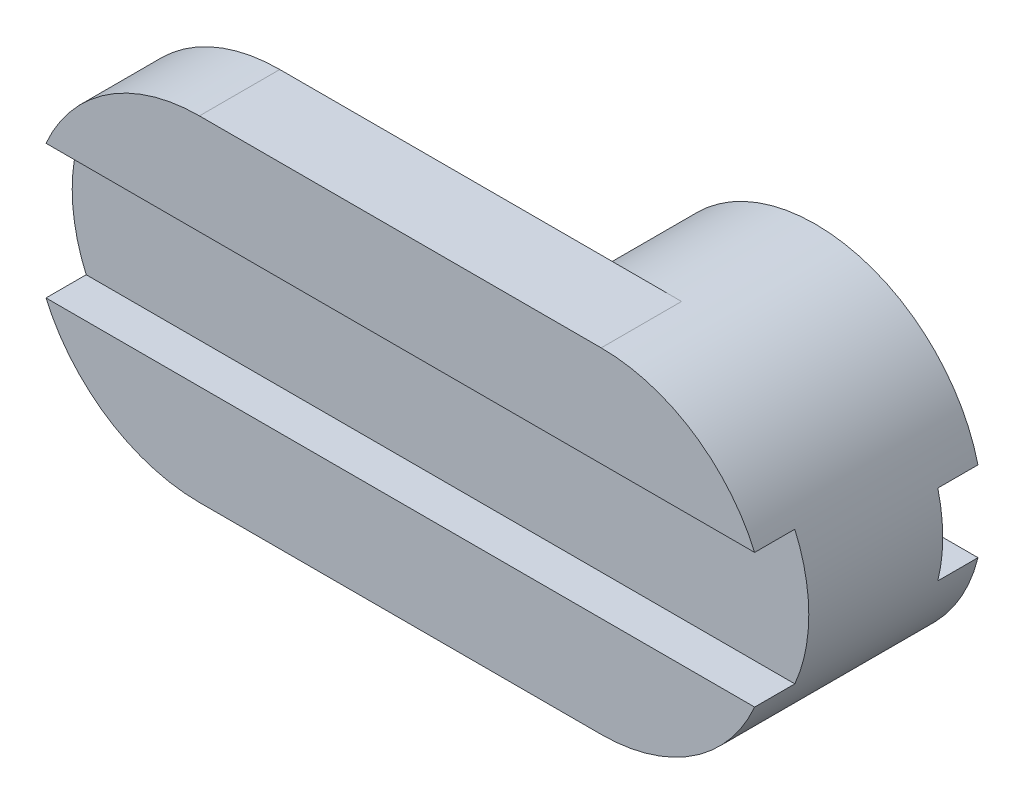
ISO-10303-21;
HEADER;
FILE_DESCRIPTION(('STEP AP214'),'2;1');
FILE_NAME('part.step','',(''),(''),'','','');
FILE_SCHEMA(('AUTOMOTIVE_DESIGN { 1 0 10303 214 1 1 1 1 }'));
ENDSEC;
DATA;
#1=APPLICATION_CONTEXT('core data for automotive mechanical design processes');
#2=APPLICATION_PROTOCOL_DEFINITION('international standard','automotive_design',2000,#1);
#3=PRODUCT_CONTEXT('',#1,'mechanical');
#4=PRODUCT('Part','Part','',(#3));
#5=PRODUCT_RELATED_PRODUCT_CATEGORY('part','',(#4));
#6=PRODUCT_DEFINITION_FORMATION('','',#4);
#7=PRODUCT_DEFINITION_CONTEXT('part definition',#1,'design');
#8=PRODUCT_DEFINITION('design','',#6,#7);
#9=PRODUCT_DEFINITION_SHAPE('','',#8);
#10=(LENGTH_UNIT() NAMED_UNIT(*) SI_UNIT(.MILLI.,.METRE.));
#11=(NAMED_UNIT(*) PLANE_ANGLE_UNIT() SI_UNIT($,.RADIAN.));
#12=(NAMED_UNIT(*) SI_UNIT($,.STERADIAN.) SOLID_ANGLE_UNIT());
#13=UNCERTAINTY_MEASURE_WITH_UNIT(LENGTH_MEASURE(1.E-05),#10,'distance_accuracy_value','');
#14=(GEOMETRIC_REPRESENTATION_CONTEXT(3) GLOBAL_UNCERTAINTY_ASSIGNED_CONTEXT((#13)) GLOBAL_UNIT_ASSIGNED_CONTEXT((#10,
#11,#12)) REPRESENTATION_CONTEXT('',''));
#15=CARTESIAN_POINT('',(0.,0.,0.));
#16=DIRECTION('',(0.,0.,1.));
#17=DIRECTION('',(1.,0.,0.));
#18=AXIS2_PLACEMENT_3D('',#15,#16,#17);
#19=CARTESIAN_POINT('',(-30.,0.,0.));
#20=DIRECTION('',(0.,0.,1.));
#21=DIRECTION('',(1.,0.,0.));
#22=AXIS2_PLACEMENT_3D('',#19,#20,#21);
#23=PLANE('',#22);
#24=CARTESIAN_POINT('',(30.,0.,0.));
#25=DIRECTION('',(0.,0.,-1.));
#26=DIRECTION('',(-1.,0.,0.));
#27=AXIS2_PLACEMENT_3D('',#24,#25,#26);
#28=CIRCLE('',#27,25.);
#29=CARTESIAN_POINT('',(30.,-25.,0.));
#30=VERTEX_POINT('',#29);
#31=CARTESIAN_POINT('',(30.,25.,0.));
#32=VERTEX_POINT('',#31);
#33=EDGE_CURVE('E301',#30,#32,#28,.T.);
#34=ORIENTED_EDGE('',*,*,#33,.F.);
#35=DIRECTION('',(1.,0.,0.));
#36=VECTOR('',#35,1.);
#37=CARTESIAN_POINT('',(30.,-25.,0.));
#38=LINE('',#37,#36);
#39=CARTESIAN_POINT('',(-30.,-25.,0.));
#40=VERTEX_POINT('',#39);
#41=EDGE_CURVE('E342',#40,#30,#38,.T.);
#42=ORIENTED_EDGE('',*,*,#41,.F.);
#43=CARTESIAN_POINT('',(-30.,0.,0.));
#44=DIRECTION('',(0.,0.,1.));
#45=DIRECTION('',(1.,0.,0.));
#46=AXIS2_PLACEMENT_3D('',#43,#44,#45);
#47=CIRCLE('',#46,25.);
#48=CARTESIAN_POINT('',(-30.,25.,0.));
#49=VERTEX_POINT('',#48);
#50=EDGE_CURVE('E326',#49,#40,#47,.T.);
#51=ORIENTED_EDGE('',*,*,#50,.F.);
#52=DIRECTION('',(-1.,0.,0.));
#53=VECTOR('',#52,1.);
#54=CARTESIAN_POINT('',(30.,25.,0.));
#55=LINE('',#54,#53);
#56=EDGE_CURVE('E345',#32,#49,#55,.T.);
#57=ORIENTED_EDGE('',*,*,#56,.F.);
#58=EDGE_LOOP('',(#34,#42,#51,#57));
#59=FACE_BOUND('',#58,.T.);
#60=CARTESIAN_POINT('',(-18.,0.,0.));
#61=DIRECTION('',(0.,0.,-1.));
#62=DIRECTION('',(-1.,0.,0.));
#63=AXIS2_PLACEMENT_3D('',#60,#61,#62);
#64=CIRCLE('',#63,12.);
#65=CARTESIAN_POINT('',(-18.,12.,0.));
#66=VERTEX_POINT('',#65);
#67=CARTESIAN_POINT('',(-18.,-12.,0.));
#68=VERTEX_POINT('',#67);
#69=EDGE_CURVE('E210',#66,#68,#64,.T.);
#70=ORIENTED_EDGE('',*,*,#69,.F.);
#71=DIRECTION('',(1.,0.,0.));
#72=VECTOR('',#71,1.);
#73=CARTESIAN_POINT('',(-18.,12.,0.));
#74=LINE('',#73,#72);
#75=CARTESIAN_POINT('',(-30.,12.,0.));
#76=VERTEX_POINT('',#75);
#77=EDGE_CURVE('E238',#76,#66,#74,.T.);
#78=ORIENTED_EDGE('',*,*,#77,.F.);
#79=CARTESIAN_POINT('',(-30.,0.,0.));
#80=DIRECTION('',(0.,0.,-1.));
#81=DIRECTION('',(-1.,0.,0.));
#82=AXIS2_PLACEMENT_3D('',#79,#80,#81);
#83=CIRCLE('',#82,12.);
#84=CARTESIAN_POINT('',(-30.,-12.,0.));
#85=VERTEX_POINT('',#84);
#86=EDGE_CURVE('E53',#85,#76,#83,.T.);
#87=ORIENTED_EDGE('',*,*,#86,.F.);
#88=DIRECTION('',(-1.,0.,0.));
#89=VECTOR('',#88,1.);
#90=CARTESIAN_POINT('',(-18.,-12.,0.));
#91=LINE('',#90,#89);
#92=EDGE_CURVE('E48',#68,#85,#91,.T.);
#93=ORIENTED_EDGE('',*,*,#92,.F.);
#94=EDGE_LOOP('',(#70,#78,#87,#93));
#95=FACE_BOUND('',#94,.T.);
#96=ADVANCED_FACE('F33',(#59,#95),#23,.F.);
#97=CARTESIAN_POINT('',(30.,0.,-20.));
#98=DIRECTION('',(0.,0.,-1.));
#99=DIRECTION('',(-1.,0.,0.));
#100=AXIS2_PLACEMENT_3D('',#97,#98,#99);
#101=PLANE('',#100);
#102=DIRECTION('',(1.,0.,0.));
#103=VECTOR('',#102,1.);
#104=CARTESIAN_POINT('',(55.,5.99999999999999,-20.));
#105=LINE('',#104,#103);
#106=CARTESIAN_POINT('',(5.7306778009768,5.99999999999999,-20.));
#107=VERTEX_POINT('',#106);
#108=CARTESIAN_POINT('',(22.,5.99999999999999,-20.));
#109=VERTEX_POINT('',#108);
#110=EDGE_CURVE('E272',#107,#109,#105,.T.);
#111=ORIENTED_EDGE('',*,*,#110,.F.);
#112=CARTESIAN_POINT('',(30.,0.,-20.));
#113=DIRECTION('',(0.,0.,-1.));
#114=DIRECTION('',(-1.,0.,0.));
#115=AXIS2_PLACEMENT_3D('',#112,#113,#114);
#116=CIRCLE('',#115,25.);
#117=CARTESIAN_POINT('',(54.2693221990232,5.99999999999999,-20.));
#118=VERTEX_POINT('',#117);
#119=EDGE_CURVE('E300',#107,#118,#116,.T.);
#120=ORIENTED_EDGE('',*,*,#119,.T.);
#121=CARTESIAN_POINT('',(38.,5.99999999999999,-20.));
#122=VERTEX_POINT('',#121);
#123=EDGE_CURVE('E261',#122,#118,#105,.T.);
#124=ORIENTED_EDGE('',*,*,#123,.F.);
#125=CARTESIAN_POINT('',(30.,0.,-20.));
#126=DIRECTION('',(0.,0.,-1.));
#127=DIRECTION('',(-1.,0.,0.));
#128=AXIS2_PLACEMENT_3D('',#125,#126,#127);
#129=CIRCLE('',#128,10.);
#130=EDGE_CURVE('E291',#109,#122,#129,.T.);
#131=ORIENTED_EDGE('',*,*,#130,.F.);
#132=EDGE_LOOP('',(#111,#120,#124,#131));
#133=FACE_BOUND('',#132,.T.);
#134=ADVANCED_FACE('F395',(#133),#101,.T.);
#135=CARTESIAN_POINT('',(-30.,0.,12.));
#136=DIRECTION('',(0.,0.,1.));
#137=DIRECTION('',(1.,0.,0.));
#138=AXIS2_PLACEMENT_3D('',#135,#136,#137);
#139=PLANE('',#138);
#140=DIRECTION('',(-1.,0.,0.));
#141=VECTOR('',#140,1.);
#142=CARTESIAN_POINT('',(-30.,10.,12.));
#143=LINE('',#142,#141);
#144=CARTESIAN_POINT('',(52.9128784747792,10.,12.));
#145=VERTEX_POINT('',#144);
#146=CARTESIAN_POINT('',(-52.9128784747792,9.99999999999999,12.));
#147=VERTEX_POINT('',#146);
#148=EDGE_CURVE('E360',#145,#147,#143,.T.);
#149=ORIENTED_EDGE('',*,*,#148,.F.);
#150=CARTESIAN_POINT('',(30.,0.,12.));
#151=DIRECTION('',(0.,0.,1.));
#152=DIRECTION('',(1.,0.,0.));
#153=AXIS2_PLACEMENT_3D('',#150,#151,#152);
#154=CIRCLE('',#153,25.);
#155=CARTESIAN_POINT('',(30.,25.,12.));
#156=VERTEX_POINT('',#155);
#157=EDGE_CURVE('E333',#145,#156,#154,.T.);
#158=ORIENTED_EDGE('',*,*,#157,.T.);
#159=DIRECTION('',(-1.,0.,0.));
#160=VECTOR('',#159,1.);
#161=CARTESIAN_POINT('',(30.,25.,12.));
#162=LINE('',#161,#160);
#163=CARTESIAN_POINT('',(-30.,25.,12.));
#164=VERTEX_POINT('',#163);
#165=EDGE_CURVE('E337',#156,#164,#162,.T.);
#166=ORIENTED_EDGE('',*,*,#165,.T.);
#167=CARTESIAN_POINT('',(-30.,0.,12.));
#168=DIRECTION('',(0.,0.,1.));
#169=DIRECTION('',(1.,0.,0.));
#170=AXIS2_PLACEMENT_3D('',#167,#168,#169);
#171=CIRCLE('',#170,25.);
#172=EDGE_CURVE('E327',#164,#147,#171,.T.);
#173=ORIENTED_EDGE('',*,*,#172,.T.);
#174=EDGE_LOOP('',(#149,#158,#166,#173));
#175=FACE_BOUND('',#174,.T.);
#176=ADVANCED_FACE('F431',(#175),#139,.T.);
#177=CARTESIAN_POINT('',(-30.,0.,12.));
#178=DIRECTION('',(0.,0.,-1.));
#179=DIRECTION('',(-1.,0.,0.));
#180=AXIS2_PLACEMENT_3D('',#177,#178,#179);
#181=CYLINDRICAL_SURFACE('',#180,25.);
#182=CARTESIAN_POINT('',(-30.,0.,6.));
#183=DIRECTION('',(0.,0.,1.));
#184=DIRECTION('',(1.,0.,0.));
#185=AXIS2_PLACEMENT_3D('',#182,#183,#184);
#186=CIRCLE('',#185,25.);
#187=CARTESIAN_POINT('',(-52.9128784747792,9.99999999999999,6.));
#188=VERTEX_POINT('',#187);
#189=CARTESIAN_POINT('',(-52.9128784747792,-10.,6.));
#190=VERTEX_POINT('',#189);
#191=EDGE_CURVE('E324',#188,#190,#186,.T.);
#192=ORIENTED_EDGE('',*,*,#191,.F.);
#193=DIRECTION('',(0.,0.,-1.));
#194=VECTOR('',#193,1.);
#195=CARTESIAN_POINT('',(-52.9128784747792,9.99999999999999,12.));
#196=LINE('',#195,#194);
#197=EDGE_CURVE('E321',#188,#147,#196,.F.);
#198=ORIENTED_EDGE('',*,*,#197,.T.);
#199=ORIENTED_EDGE('',*,*,#172,.F.);
#200=DIRECTION('',(0.,0.,-1.));
#201=VECTOR('',#200,1.);
#202=CARTESIAN_POINT('',(-30.,25.,12.));
#203=LINE('',#202,#201);
#204=EDGE_CURVE('E339',#164,#49,#203,.T.);
#205=ORIENTED_EDGE('',*,*,#204,.T.);
#206=ORIENTED_EDGE('',*,*,#50,.T.);
#207=DIRECTION('',(0.,0.,-1.));
#208=VECTOR('',#207,1.);
#209=CARTESIAN_POINT('',(-30.,-25.,12.));
#210=LINE('',#209,#208);
#211=CARTESIAN_POINT('',(-30.,-25.,12.));
#212=VERTEX_POINT('',#211);
#213=EDGE_CURVE('E355',#212,#40,#210,.T.);
#214=ORIENTED_EDGE('',*,*,#213,.F.);
#215=CARTESIAN_POINT('',(-52.9128784747792,-10.,12.));
#216=VERTEX_POINT('',#215);
#217=EDGE_CURVE('E331',#216,#212,#171,.T.);
#218=ORIENTED_EDGE('',*,*,#217,.F.);
#219=DIRECTION('',(0.,0.,-1.));
#220=VECTOR('',#219,1.);
#221=CARTESIAN_POINT('',(-52.9128784747792,-10.,12.));
#222=LINE('',#221,#220);
#223=EDGE_CURVE('E315',#216,#190,#222,.T.);
#224=ORIENTED_EDGE('',*,*,#223,.T.);
#225=EDGE_LOOP('',(#192,#198,#199,#205,#206,#214,#218,#224));
#226=FACE_BOUND('',#225,.T.);
#227=ADVANCED_FACE('F35',(#226),#181,.T.);
#228=CARTESIAN_POINT('',(30.,-25.,12.));
#229=DIRECTION('',(0.,1.,0.));
#230=DIRECTION('',(-1.,0.,0.));
#231=AXIS2_PLACEMENT_3D('',#228,#229,#230);
#232=PLANE('',#231);
#233=ORIENTED_EDGE('',*,*,#41,.T.);
#234=DIRECTION('',(0.,0.,-1.));
#235=VECTOR('',#234,1.);
#236=CARTESIAN_POINT('',(30.,-25.,12.));
#237=LINE('',#236,#235);
#238=CARTESIAN_POINT('',(30.,-25.,12.));
#239=VERTEX_POINT('',#238);
#240=EDGE_CURVE('E352',#239,#30,#237,.T.);
#241=ORIENTED_EDGE('',*,*,#240,.F.);
#242=DIRECTION('',(1.,0.,0.));
#243=VECTOR('',#242,1.);
#244=CARTESIAN_POINT('',(30.,-25.,12.));
#245=LINE('',#244,#243);
#246=EDGE_CURVE('E330',#212,#239,#245,.T.);
#247=ORIENTED_EDGE('',*,*,#246,.F.);
#248=ORIENTED_EDGE('',*,*,#213,.T.);
#249=EDGE_LOOP('',(#233,#241,#247,#248));
#250=FACE_BOUND('',#249,.T.);
#251=ADVANCED_FACE('F582',(#250),#232,.F.);
#252=CARTESIAN_POINT('',(30.,0.,12.));
#253=DIRECTION('',(0.,0.,-1.));
#254=DIRECTION('',(-1.,0.,0.));
#255=AXIS2_PLACEMENT_3D('',#252,#253,#254);
#256=CYLINDRICAL_SURFACE('',#255,25.);
#257=CARTESIAN_POINT('',(30.,0.,-14.));
#258=DIRECTION('',(0.,0.,-1.));
#259=DIRECTION('',(-1.,0.,0.));
#260=AXIS2_PLACEMENT_3D('',#257,#258,#259);
#261=CIRCLE('',#260,25.);
#262=CARTESIAN_POINT('',(54.2693221990232,5.99999999999999,-14.));
#263=VERTEX_POINT('',#262);
#264=CARTESIAN_POINT('',(54.2693221990232,-5.99999999999999,-14.));
#265=VERTEX_POINT('',#264);
#266=EDGE_CURVE('E275',#263,#265,#261,.T.);
#267=ORIENTED_EDGE('',*,*,#266,.F.);
#268=DIRECTION('',(0.,0.,-1.));
#269=VECTOR('',#268,1.);
#270=CARTESIAN_POINT('',(54.2693221990232,5.99999999999999,12.));
#271=LINE('',#270,#269);
#272=EDGE_CURVE('E287',#263,#118,#271,.T.);
#273=ORIENTED_EDGE('',*,*,#272,.T.);
#274=ORIENTED_EDGE('',*,*,#119,.F.);
#275=DIRECTION('',(0.,0.,-1.));
#276=VECTOR('',#275,1.);
#277=CARTESIAN_POINT('',(5.7306778009768,5.99999999999999,12.));
#278=LINE('',#277,#276);
#279=CARTESIAN_POINT('',(5.7306778009768,5.99999999999999,-14.));
#280=VERTEX_POINT('',#279);
#281=EDGE_CURVE('E284',#107,#280,#278,.F.);
#282=ORIENTED_EDGE('',*,*,#281,.T.);
#283=CARTESIAN_POINT('',(5.7306778009768,-5.99999999999999,-14.));
#284=VERTEX_POINT('',#283);
#285=EDGE_CURVE('E278',#284,#280,#261,.T.);
#286=ORIENTED_EDGE('',*,*,#285,.F.);
#287=DIRECTION('',(0.,0.,-1.));
#288=VECTOR('',#287,1.);
#289=CARTESIAN_POINT('',(5.7306778009768,-5.99999999999999,12.));
#290=LINE('',#289,#288);
#291=CARTESIAN_POINT('',(5.7306778009768,-5.99999999999999,-20.));
#292=VERTEX_POINT('',#291);
#293=EDGE_CURVE('E281',#284,#292,#290,.T.);
#294=ORIENTED_EDGE('',*,*,#293,.T.);
#295=CARTESIAN_POINT('',(54.2693221990232,-5.99999999999999,-20.));
#296=VERTEX_POINT('',#295);
#297=EDGE_CURVE('E294',#296,#292,#116,.T.);
#298=ORIENTED_EDGE('',*,*,#297,.F.);
#299=DIRECTION('',(0.,0.,-1.));
#300=VECTOR('',#299,1.);
#301=CARTESIAN_POINT('',(54.2693221990232,-5.99999999999999,12.));
#302=LINE('',#301,#300);
#303=EDGE_CURVE('E277',#296,#265,#302,.F.);
#304=ORIENTED_EDGE('',*,*,#303,.T.);
#305=EDGE_LOOP('',(#267,#273,#274,#282,#286,#294,#298,#304));
#306=FACE_BOUND('',#305,.T.);
#307=ORIENTED_EDGE('',*,*,#157,.F.);
#308=DIRECTION('',(0.,0.,-1.));
#309=VECTOR('',#308,1.);
#310=CARTESIAN_POINT('',(52.9128784747792,10.,12.));
#311=LINE('',#310,#309);
#312=CARTESIAN_POINT('',(52.9128784747792,10.,6.));
#313=VERTEX_POINT('',#312);
#314=EDGE_CURVE('E318',#145,#313,#311,.T.);
#315=ORIENTED_EDGE('',*,*,#314,.T.);
#316=CARTESIAN_POINT('',(30.,0.,6.));
#317=DIRECTION('',(0.,0.,1.));
#318=DIRECTION('',(1.,0.,0.));
#319=AXIS2_PLACEMENT_3D('',#316,#317,#318);
#320=CIRCLE('',#319,25.);
#321=CARTESIAN_POINT('',(52.9128784747792,-9.99999999999999,6.));
#322=VERTEX_POINT('',#321);
#323=EDGE_CURVE('E305',#322,#313,#320,.T.);
#324=ORIENTED_EDGE('',*,*,#323,.F.);
#325=DIRECTION('',(0.,0.,-1.));
#326=VECTOR('',#325,1.);
#327=CARTESIAN_POINT('',(52.9128784747792,-9.99999999999999,12.));
#328=LINE('',#327,#326);
#329=CARTESIAN_POINT('',(52.9128784747792,-9.99999999999999,12.));
#330=VERTEX_POINT('',#329);
#331=EDGE_CURVE('E312',#322,#330,#328,.F.);
#332=ORIENTED_EDGE('',*,*,#331,.T.);
#333=EDGE_CURVE('E334',#239,#330,#154,.T.);
#334=ORIENTED_EDGE('',*,*,#333,.F.);
#335=ORIENTED_EDGE('',*,*,#240,.T.);
#336=ORIENTED_EDGE('',*,*,#33,.T.);
#337=DIRECTION('',(0.,0.,-1.));
#338=VECTOR('',#337,1.);
#339=CARTESIAN_POINT('',(30.,25.,12.));
#340=LINE('',#339,#338);
#341=EDGE_CURVE('E349',#156,#32,#340,.T.);
#342=ORIENTED_EDGE('',*,*,#341,.F.);
#343=EDGE_LOOP('',(#307,#315,#324,#332,#334,#335,#336,#342));
#344=FACE_BOUND('',#343,.T.);
#345=ADVANCED_FACE('F391',(#306,#344),#256,.T.);
#346=CARTESIAN_POINT('',(30.,25.,12.));
#347=DIRECTION('',(0.,-1.,0.));
#348=DIRECTION('',(1.,0.,0.));
#349=AXIS2_PLACEMENT_3D('',#346,#347,#348);
#350=PLANE('',#349);
#351=ORIENTED_EDGE('',*,*,#56,.T.);
#352=ORIENTED_EDGE('',*,*,#204,.F.);
#353=ORIENTED_EDGE('',*,*,#165,.F.);
#354=ORIENTED_EDGE('',*,*,#341,.T.);
#355=EDGE_LOOP('',(#351,#352,#353,#354));
#356=FACE_BOUND('',#355,.T.);
#357=ADVANCED_FACE('F581',(#356),#350,.F.);
#358=DIRECTION('',(1.,0.,0.));
#359=VECTOR('',#358,1.);
#360=CARTESIAN_POINT('',(-30.,-10.,12.));
#361=LINE('',#360,#359);
#362=EDGE_CURVE('E358',#216,#330,#361,.T.);
#363=ORIENTED_EDGE('',*,*,#362,.F.);
#364=ORIENTED_EDGE('',*,*,#217,.T.);
#365=ORIENTED_EDGE('',*,*,#246,.T.);
#366=ORIENTED_EDGE('',*,*,#333,.T.);
#367=EDGE_LOOP('',(#363,#364,#365,#366));
#368=FACE_BOUND('',#367,.T.);
#369=ADVANCED_FACE('F527',(#368),#139,.T.);
#370=CARTESIAN_POINT('',(0.,0.,6.));
#371=DIRECTION('',(0.,0.,1.));
#372=DIRECTION('',(1.,0.,0.));
#373=AXIS2_PLACEMENT_3D('',#370,#371,#372);
#374=PLANE('',#373);
#375=ORIENTED_EDGE('',*,*,#191,.T.);
#376=DIRECTION('',(1.,0.,0.));
#377=VECTOR('',#376,1.);
#378=CARTESIAN_POINT('',(57.6844646731594,-9.99999999999999,6.));
#379=LINE('',#378,#377);
#380=EDGE_CURVE('E306',#190,#322,#379,.T.);
#381=ORIENTED_EDGE('',*,*,#380,.T.);
#382=ORIENTED_EDGE('',*,*,#323,.T.);
#383=DIRECTION('',(-1.,0.,0.));
#384=VECTOR('',#383,1.);
#385=CARTESIAN_POINT('',(57.6844646731594,10.,6.));
#386=LINE('',#385,#384);
#387=EDGE_CURVE('E309',#313,#188,#386,.T.);
#388=ORIENTED_EDGE('',*,*,#387,.T.);
#389=EDGE_LOOP('',(#375,#381,#382,#388));
#390=FACE_BOUND('',#389,.T.);
#391=ADVANCED_FACE('F541',(#390),#374,.T.);
#392=CARTESIAN_POINT('',(57.6844646731594,10.,6.));
#393=DIRECTION('',(0.,1.,0.));
#394=DIRECTION('',(-1.,0.,0.));
#395=AXIS2_PLACEMENT_3D('',#392,#393,#394);
#396=PLANE('',#395);
#397=ORIENTED_EDGE('',*,*,#387,.F.);
#398=ORIENTED_EDGE('',*,*,#314,.F.);
#399=ORIENTED_EDGE('',*,*,#148,.T.);
#400=ORIENTED_EDGE('',*,*,#197,.F.);
#401=EDGE_LOOP('',(#397,#398,#399,#400));
#402=FACE_BOUND('',#401,.T.);
#403=ADVANCED_FACE('F547',(#402),#396,.F.);
#404=CARTESIAN_POINT('',(57.6844646731594,-9.99999999999999,6.));
#405=DIRECTION('',(0.,-1.,0.));
#406=DIRECTION('',(1.,0.,0.));
#407=AXIS2_PLACEMENT_3D('',#404,#405,#406);
#408=PLANE('',#407);
#409=ORIENTED_EDGE('',*,*,#362,.T.);
#410=ORIENTED_EDGE('',*,*,#331,.F.);
#411=ORIENTED_EDGE('',*,*,#380,.F.);
#412=ORIENTED_EDGE('',*,*,#223,.F.);
#413=EDGE_LOOP('',(#409,#410,#411,#412));
#414=FACE_BOUND('',#413,.T.);
#415=ADVANCED_FACE('F556',(#414),#408,.F.);
#416=DIRECTION('',(-1.,0.,0.));
#417=VECTOR('',#416,1.);
#418=CARTESIAN_POINT('',(55.,-5.99999999999999,-20.));
#419=LINE('',#418,#417);
#420=CARTESIAN_POINT('',(38.,-5.99999999999999,-20.));
#421=VERTEX_POINT('',#420);
#422=EDGE_CURVE('E266',#296,#421,#419,.T.);
#423=ORIENTED_EDGE('',*,*,#422,.F.);
#424=ORIENTED_EDGE('',*,*,#297,.T.);
#425=CARTESIAN_POINT('',(22.,-5.99999999999999,-20.));
#426=VERTEX_POINT('',#425);
#427=EDGE_CURVE('E273',#426,#292,#419,.T.);
#428=ORIENTED_EDGE('',*,*,#427,.F.);
#429=EDGE_CURVE('E295',#421,#426,#129,.T.);
#430=ORIENTED_EDGE('',*,*,#429,.F.);
#431=EDGE_LOOP('',(#423,#424,#428,#430));
#432=FACE_BOUND('',#431,.T.);
#433=ADVANCED_FACE('F412',(#432),#101,.T.);
#434=CARTESIAN_POINT('',(30.,0.,-20.));
#435=DIRECTION('',(0.,0.,1.));
#436=DIRECTION('',(1.,0.,0.));
#437=AXIS2_PLACEMENT_3D('',#434,#435,#436);
#438=CYLINDRICAL_SURFACE('',#437,10.);
#439=DIRECTION('',(0.,0.,1.));
#440=VECTOR('',#439,1.);
#441=CARTESIAN_POINT('',(38.,5.99999999999999,-20.));
#442=LINE('',#441,#440);
#443=CARTESIAN_POINT('',(38.,5.99999999999999,-14.));
#444=VERTEX_POINT('',#443);
#445=EDGE_CURVE('E11',#444,#122,#442,.F.);
#446=ORIENTED_EDGE('',*,*,#445,.F.);
#447=CARTESIAN_POINT('',(30.,0.,-14.));
#448=DIRECTION('',(0.,0.,-1.));
#449=DIRECTION('',(-1.,0.,0.));
#450=AXIS2_PLACEMENT_3D('',#447,#448,#449);
#451=CIRCLE('',#450,10.);
#452=CARTESIAN_POINT('',(38.,-5.99999999999999,-14.));
#453=VERTEX_POINT('',#452);
#454=EDGE_CURVE('E366',#444,#453,#451,.T.);
#455=ORIENTED_EDGE('',*,*,#454,.T.);
#456=DIRECTION('',(0.,0.,1.));
#457=VECTOR('',#456,1.);
#458=CARTESIAN_POINT('',(38.,-5.99999999999999,-20.));
#459=LINE('',#458,#457);
#460=EDGE_CURVE('E41',#421,#453,#459,.T.);
#461=ORIENTED_EDGE('',*,*,#460,.F.);
#462=ORIENTED_EDGE('',*,*,#429,.T.);
#463=DIRECTION('',(0.,0.,1.));
#464=VECTOR('',#463,1.);
#465=CARTESIAN_POINT('',(22.,-5.99999999999999,-20.));
#466=LINE('',#465,#464);
#467=CARTESIAN_POINT('',(22.,-5.99999999999999,-14.));
#468=VERTEX_POINT('',#467);
#469=EDGE_CURVE('E365',#468,#426,#466,.F.);
#470=ORIENTED_EDGE('',*,*,#469,.F.);
#471=CARTESIAN_POINT('',(22.,5.99999999999999,-14.));
#472=VERTEX_POINT('',#471);
#473=EDGE_CURVE('E304',#468,#472,#451,.T.);
#474=ORIENTED_EDGE('',*,*,#473,.T.);
#475=DIRECTION('',(0.,0.,1.));
#476=VECTOR('',#475,1.);
#477=CARTESIAN_POINT('',(22.,5.99999999999999,-20.));
#478=LINE('',#477,#476);
#479=EDGE_CURVE('E368',#109,#472,#478,.T.);
#480=ORIENTED_EDGE('',*,*,#479,.F.);
#481=ORIENTED_EDGE('',*,*,#130,.T.);
#482=EDGE_LOOP('',(#446,#455,#461,#462,#470,#474,#480,#481));
#483=FACE_BOUND('',#482,.T.);
#484=CARTESIAN_POINT('',(30.,0.,0.));
#485=DIRECTION('',(0.,0.,-1.));
#486=DIRECTION('',(-1.,0.,0.));
#487=AXIS2_PLACEMENT_3D('',#484,#485,#486);
#488=CIRCLE('',#487,10.);
#489=CARTESIAN_POINT('',(20.,0.,0.));
#490=VERTEX_POINT('',#489);
#491=EDGE_CURVE('E290',#490,#490,#488,.T.);
#492=ORIENTED_EDGE('',*,*,#491,.F.);
#493=EDGE_LOOP('',(#492));
#494=FACE_BOUND('',#493,.T.);
#495=ADVANCED_FACE('F377',(#483,#494),#438,.F.);
#496=ORIENTED_EDGE('',*,*,#491,.T.);
#497=EDGE_LOOP('',(#496));
#498=FACE_BOUND('',#497,.T.);
#499=ADVANCED_FACE('F426',(#498),#23,.F.);
#500=CARTESIAN_POINT('',(0.,0.,-14.));
#501=DIRECTION('',(0.,0.,-1.));
#502=DIRECTION('',(-1.,0.,0.));
#503=AXIS2_PLACEMENT_3D('',#500,#501,#502);
#504=PLANE('',#503);
#505=ORIENTED_EDGE('',*,*,#285,.T.);
#506=DIRECTION('',(1.,0.,0.));
#507=VECTOR('',#506,1.);
#508=CARTESIAN_POINT('',(55.,5.99999999999999,-14.));
#509=LINE('',#508,#507);
#510=EDGE_CURVE('E265',#280,#472,#509,.T.);
#511=ORIENTED_EDGE('',*,*,#510,.T.);
#512=ORIENTED_EDGE('',*,*,#473,.F.);
#513=DIRECTION('',(-1.,0.,0.));
#514=VECTOR('',#513,1.);
#515=CARTESIAN_POINT('',(55.,-5.99999999999999,-14.));
#516=LINE('',#515,#514);
#517=EDGE_CURVE('E267',#468,#284,#516,.T.);
#518=ORIENTED_EDGE('',*,*,#517,.T.);
#519=EDGE_LOOP('',(#505,#511,#512,#518));
#520=FACE_BOUND('',#519,.T.);
#521=ADVANCED_FACE('F404',(#520),#504,.T.);
#522=CARTESIAN_POINT('',(55.,-5.99999999999999,-14.));
#523=DIRECTION('',(0.,-1.,0.));
#524=DIRECTION('',(0.,0.,-1.));
#525=AXIS2_PLACEMENT_3D('',#522,#523,#524);
#526=PLANE('',#525);
#527=ORIENTED_EDGE('',*,*,#517,.F.);
#528=ORIENTED_EDGE('',*,*,#469,.T.);
#529=ORIENTED_EDGE('',*,*,#427,.T.);
#530=ORIENTED_EDGE('',*,*,#293,.F.);
#531=EDGE_LOOP('',(#527,#528,#529,#530));
#532=FACE_BOUND('',#531,.T.);
#533=ADVANCED_FACE('F407',(#532),#526,.F.);
#534=CARTESIAN_POINT('',(55.,5.99999999999999,-14.));
#535=DIRECTION('',(0.,1.,0.));
#536=DIRECTION('',(0.,0.,1.));
#537=AXIS2_PLACEMENT_3D('',#534,#535,#536);
#538=PLANE('',#537);
#539=ORIENTED_EDGE('',*,*,#110,.T.);
#540=ORIENTED_EDGE('',*,*,#479,.T.);
#541=ORIENTED_EDGE('',*,*,#510,.F.);
#542=ORIENTED_EDGE('',*,*,#281,.F.);
#543=EDGE_LOOP('',(#539,#540,#541,#542));
#544=FACE_BOUND('',#543,.T.);
#545=ADVANCED_FACE('F399',(#544),#538,.F.);
#546=EDGE_CURVE('E262',#444,#263,#509,.T.);
#547=ORIENTED_EDGE('',*,*,#546,.F.);
#548=ORIENTED_EDGE('',*,*,#445,.T.);
#549=ORIENTED_EDGE('',*,*,#123,.T.);
#550=ORIENTED_EDGE('',*,*,#272,.F.);
#551=EDGE_LOOP('',(#547,#548,#549,#550));
#552=FACE_BOUND('',#551,.T.);
#553=ADVANCED_FACE('F386',(#552),#538,.F.);
#554=ORIENTED_EDGE('',*,*,#422,.T.);
#555=ORIENTED_EDGE('',*,*,#460,.T.);
#556=EDGE_CURVE('E270',#265,#453,#516,.T.);
#557=ORIENTED_EDGE('',*,*,#556,.F.);
#558=ORIENTED_EDGE('',*,*,#303,.F.);
#559=EDGE_LOOP('',(#554,#555,#557,#558));
#560=FACE_BOUND('',#559,.T.);
#561=ADVANCED_FACE('F413',(#560),#526,.F.);
#562=ORIENTED_EDGE('',*,*,#266,.T.);
#563=ORIENTED_EDGE('',*,*,#556,.T.);
#564=ORIENTED_EDGE('',*,*,#454,.F.);
#565=ORIENTED_EDGE('',*,*,#546,.T.);
#566=EDGE_LOOP('',(#562,#563,#564,#565));
#567=FACE_BOUND('',#566,.T.);
#568=ADVANCED_FACE('F383',(#567),#504,.T.);
#569=CARTESIAN_POINT('',(-18.,0.,-4.));
#570=DIRECTION('',(0.,0.,-1.));
#571=DIRECTION('',(-1.,0.,0.));
#572=AXIS2_PLACEMENT_3D('',#569,#570,#571);
#573=PLANE('',#572);
#574=CARTESIAN_POINT('',(-18.,0.,-4.));
#575=DIRECTION('',(0.,0.,-1.));
#576=DIRECTION('',(-1.,0.,0.));
#577=AXIS2_PLACEMENT_3D('',#574,#575,#576);
#578=CIRCLE('',#577,12.);
#579=CARTESIAN_POINT('',(-18.,12.,-4.));
#580=VERTEX_POINT('',#579);
#581=CARTESIAN_POINT('',(-18.,-12.,-4.));
#582=VERTEX_POINT('',#581);
#583=EDGE_CURVE('E234',#580,#582,#578,.T.);
#584=ORIENTED_EDGE('',*,*,#583,.T.);
#585=DIRECTION('',(-1.,0.,0.));
#586=VECTOR('',#585,1.);
#587=CARTESIAN_POINT('',(-18.,-12.,-4.));
#588=LINE('',#587,#586);
#589=CARTESIAN_POINT('',(-30.,-12.,-4.));
#590=VERTEX_POINT('',#589);
#591=EDGE_CURVE('E237',#582,#590,#588,.T.);
#592=ORIENTED_EDGE('',*,*,#591,.T.);
#593=CARTESIAN_POINT('',(-30.,0.,-4.));
#594=DIRECTION('',(0.,0.,-1.));
#595=DIRECTION('',(-1.,0.,0.));
#596=AXIS2_PLACEMENT_3D('',#593,#594,#595);
#597=CIRCLE('',#596,12.);
#598=CARTESIAN_POINT('',(-30.,12.,-4.));
#599=VERTEX_POINT('',#598);
#600=EDGE_CURVE('E240',#590,#599,#597,.T.);
#601=ORIENTED_EDGE('',*,*,#600,.T.);
#602=DIRECTION('',(1.,0.,0.));
#603=VECTOR('',#602,1.);
#604=CARTESIAN_POINT('',(-18.,12.,-4.));
#605=LINE('',#604,#603);
#606=EDGE_CURVE('E242',#599,#580,#605,.T.);
#607=ORIENTED_EDGE('',*,*,#606,.T.);
#608=EDGE_LOOP('',(#584,#592,#601,#607));
#609=FACE_BOUND('',#608,.T.);
#610=DIRECTION('',(-1.,0.,0.));
#611=VECTOR('',#610,1.);
#612=CARTESIAN_POINT('',(-18.,-5.99999999999999,-4.));
#613=LINE('',#612,#611);
#614=CARTESIAN_POINT('',(-18.,-5.99999999999999,-4.));
#615=VERTEX_POINT('',#614);
#616=CARTESIAN_POINT('',(-30.,-6.,-4.));
#617=VERTEX_POINT('',#616);
#618=EDGE_CURVE('E202',#615,#617,#613,.T.);
#619=ORIENTED_EDGE('',*,*,#618,.F.);
#620=CARTESIAN_POINT('',(-18.,0.,-4.));
#621=DIRECTION('',(0.,0.,-1.));
#622=DIRECTION('',(-1.,0.,0.));
#623=AXIS2_PLACEMENT_3D('',#620,#621,#622);
#624=CIRCLE('',#623,5.99999999999999);
#625=CARTESIAN_POINT('',(-18.,5.99999999999999,-4.));
#626=VERTEX_POINT('',#625);
#627=EDGE_CURVE('E192',#626,#615,#624,.T.);
#628=ORIENTED_EDGE('',*,*,#627,.F.);
#629=DIRECTION('',(1.,0.,0.));
#630=VECTOR('',#629,1.);
#631=CARTESIAN_POINT('',(-18.,5.99999999999999,-4.));
#632=LINE('',#631,#630);
#633=CARTESIAN_POINT('',(-30.,6.,-4.));
#634=VERTEX_POINT('',#633);
#635=EDGE_CURVE('E218',#634,#626,#632,.T.);
#636=ORIENTED_EDGE('',*,*,#635,.F.);
#637=CARTESIAN_POINT('',(-30.,0.,-4.));
#638=DIRECTION('',(0.,0.,-1.));
#639=DIRECTION('',(-1.,0.,0.));
#640=AXIS2_PLACEMENT_3D('',#637,#638,#639);
#641=CIRCLE('',#640,5.99999999999999);
#642=EDGE_CURVE('E216',#617,#634,#641,.T.);
#643=ORIENTED_EDGE('',*,*,#642,.F.);
#644=EDGE_LOOP('',(#619,#628,#636,#643));
#645=FACE_BOUND('',#644,.T.);
#646=ADVANCED_FACE('F214',(#609,#645),#573,.T.);
#647=CARTESIAN_POINT('',(-18.,0.,-4.));
#648=DIRECTION('',(0.,0.,1.));
#649=DIRECTION('',(1.,0.,0.));
#650=AXIS2_PLACEMENT_3D('',#647,#648,#649);
#651=CYLINDRICAL_SURFACE('',#650,12.);
#652=ORIENTED_EDGE('',*,*,#69,.T.);
#653=DIRECTION('',(0.,0.,1.));
#654=VECTOR('',#653,1.);
#655=CARTESIAN_POINT('',(-18.,-12.,-4.));
#656=LINE('',#655,#654);
#657=EDGE_CURVE('E259',#582,#68,#656,.T.);
#658=ORIENTED_EDGE('',*,*,#657,.F.);
#659=ORIENTED_EDGE('',*,*,#583,.F.);
#660=DIRECTION('',(0.,0.,1.));
#661=VECTOR('',#660,1.);
#662=CARTESIAN_POINT('',(-18.,12.,-4.));
#663=LINE('',#662,#661);
#664=EDGE_CURVE('E244',#580,#66,#663,.T.);
#665=ORIENTED_EDGE('',*,*,#664,.T.);
#666=EDGE_LOOP('',(#652,#658,#659,#665));
#667=FACE_BOUND('',#666,.T.);
#668=ADVANCED_FACE('F461',(#667),#651,.T.);
#669=CARTESIAN_POINT('',(-18.,-12.,-4.));
#670=DIRECTION('',(0.,1.,0.));
#671=DIRECTION('',(-1.,0.,0.));
#672=AXIS2_PLACEMENT_3D('',#669,#670,#671);
#673=PLANE('',#672);
#674=ORIENTED_EDGE('',*,*,#92,.T.);
#675=DIRECTION('',(0.,0.,1.));
#676=VECTOR('',#675,1.);
#677=CARTESIAN_POINT('',(-30.,-12.,-4.));
#678=LINE('',#677,#676);
#679=EDGE_CURVE('E256',#590,#85,#678,.T.);
#680=ORIENTED_EDGE('',*,*,#679,.F.);
#681=ORIENTED_EDGE('',*,*,#591,.F.);
#682=ORIENTED_EDGE('',*,*,#657,.T.);
#683=EDGE_LOOP('',(#674,#680,#681,#682));
#684=FACE_BOUND('',#683,.T.);
#685=ADVANCED_FACE('F469',(#684),#673,.F.);
#686=CARTESIAN_POINT('',(-30.,0.,-4.));
#687=DIRECTION('',(0.,0.,1.));
#688=DIRECTION('',(1.,0.,0.));
#689=AXIS2_PLACEMENT_3D('',#686,#687,#688);
#690=CYLINDRICAL_SURFACE('',#689,12.);
#691=ORIENTED_EDGE('',*,*,#86,.T.);
#692=DIRECTION('',(0.,0.,1.));
#693=VECTOR('',#692,1.);
#694=CARTESIAN_POINT('',(-30.,12.,-4.));
#695=LINE('',#694,#693);
#696=EDGE_CURVE('E253',#599,#76,#695,.T.);
#697=ORIENTED_EDGE('',*,*,#696,.F.);
#698=ORIENTED_EDGE('',*,*,#600,.F.);
#699=ORIENTED_EDGE('',*,*,#679,.T.);
#700=EDGE_LOOP('',(#691,#697,#698,#699));
#701=FACE_BOUND('',#700,.T.);
#702=ADVANCED_FACE('F465',(#701),#690,.T.);
#703=CARTESIAN_POINT('',(-18.,12.,-4.));
#704=DIRECTION('',(0.,-1.,0.));
#705=DIRECTION('',(1.,0.,0.));
#706=AXIS2_PLACEMENT_3D('',#703,#704,#705);
#707=PLANE('',#706);
#708=ORIENTED_EDGE('',*,*,#77,.T.);
#709=ORIENTED_EDGE('',*,*,#664,.F.);
#710=ORIENTED_EDGE('',*,*,#606,.F.);
#711=ORIENTED_EDGE('',*,*,#696,.T.);
#712=EDGE_LOOP('',(#708,#709,#710,#711));
#713=FACE_BOUND('',#712,.T.);
#714=ADVANCED_FACE('F458',(#713),#707,.F.);
#715=CARTESIAN_POINT('',(-18.,0.,-4.));
#716=DIRECTION('',(0.,0.,1.));
#717=DIRECTION('',(1.,0.,0.));
#718=AXIS2_PLACEMENT_3D('',#715,#716,#717);
#719=CYLINDRICAL_SURFACE('',#718,5.99999999999999);
#720=CARTESIAN_POINT('',(-18.,0.,0.));
#721=DIRECTION('',(0.,0.,-1.));
#722=DIRECTION('',(-1.,0.,0.));
#723=AXIS2_PLACEMENT_3D('',#720,#721,#722);
#724=CIRCLE('',#723,5.99999999999999);
#725=CARTESIAN_POINT('',(-18.,5.99999999999999,0.));
#726=VERTEX_POINT('',#725);
#727=CARTESIAN_POINT('',(-18.,-5.99999999999999,0.));
#728=VERTEX_POINT('',#727);
#729=EDGE_CURVE('E222',#726,#728,#724,.T.);
#730=ORIENTED_EDGE('',*,*,#729,.F.);
#731=DIRECTION('',(0.,0.,1.));
#732=VECTOR('',#731,1.);
#733=CARTESIAN_POINT('',(-18.,5.99999999999999,-4.));
#734=LINE('',#733,#732);
#735=EDGE_CURVE('E198',#626,#726,#734,.T.);
#736=ORIENTED_EDGE('',*,*,#735,.F.);
#737=ORIENTED_EDGE('',*,*,#627,.T.);
#738=DIRECTION('',(0.,0.,1.));
#739=VECTOR('',#738,1.);
#740=CARTESIAN_POINT('',(-18.,-5.99999999999999,-4.));
#741=LINE('',#740,#739);
#742=EDGE_CURVE('E196',#615,#728,#741,.T.);
#743=ORIENTED_EDGE('',*,*,#742,.T.);
#744=EDGE_LOOP('',(#730,#736,#737,#743));
#745=FACE_BOUND('',#744,.T.);
#746=ADVANCED_FACE('F195',(#745),#719,.F.);
#747=CARTESIAN_POINT('',(-18.,-5.99999999999999,-4.));
#748=DIRECTION('',(0.,1.,0.));
#749=DIRECTION('',(-1.,0.,0.));
#750=AXIS2_PLACEMENT_3D('',#747,#748,#749);
#751=PLANE('',#750);
#752=DIRECTION('',(-1.,0.,0.));
#753=VECTOR('',#752,1.);
#754=CARTESIAN_POINT('',(-18.,-5.99999999999999,0.));
#755=LINE('',#754,#753);
#756=CARTESIAN_POINT('',(-30.,-6.,0.));
#757=VERTEX_POINT('',#756);
#758=EDGE_CURVE('E209',#728,#757,#755,.T.);
#759=ORIENTED_EDGE('',*,*,#758,.F.);
#760=ORIENTED_EDGE('',*,*,#742,.F.);
#761=ORIENTED_EDGE('',*,*,#618,.T.);
#762=DIRECTION('',(0.,0.,1.));
#763=VECTOR('',#762,1.);
#764=CARTESIAN_POINT('',(-30.,-6.,-4.));
#765=LINE('',#764,#763);
#766=EDGE_CURVE('E211',#617,#757,#765,.T.);
#767=ORIENTED_EDGE('',*,*,#766,.T.);
#768=EDGE_LOOP('',(#759,#760,#761,#767));
#769=FACE_BOUND('',#768,.T.);
#770=ADVANCED_FACE('F206',(#769),#751,.T.);
#771=CARTESIAN_POINT('',(-30.,0.,-4.));
#772=DIRECTION('',(0.,0.,1.));
#773=DIRECTION('',(1.,0.,0.));
#774=AXIS2_PLACEMENT_3D('',#771,#772,#773);
#775=CYLINDRICAL_SURFACE('',#774,5.99999999999999);
#776=CARTESIAN_POINT('',(-30.,0.,0.));
#777=DIRECTION('',(0.,0.,-1.));
#778=DIRECTION('',(-1.,0.,0.));
#779=AXIS2_PLACEMENT_3D('',#776,#777,#778);
#780=CIRCLE('',#779,5.99999999999999);
#781=CARTESIAN_POINT('',(-30.,6.,0.));
#782=VERTEX_POINT('',#781);
#783=EDGE_CURVE('E225',#757,#782,#780,.T.);
#784=ORIENTED_EDGE('',*,*,#783,.F.);
#785=ORIENTED_EDGE('',*,*,#766,.F.);
#786=ORIENTED_EDGE('',*,*,#642,.T.);
#787=DIRECTION('',(0.,0.,1.));
#788=VECTOR('',#787,1.);
#789=CARTESIAN_POINT('',(-30.,6.,-4.));
#790=LINE('',#789,#788);
#791=EDGE_CURVE('E231',#634,#782,#790,.T.);
#792=ORIENTED_EDGE('',*,*,#791,.T.);
#793=EDGE_LOOP('',(#784,#785,#786,#792));
#794=FACE_BOUND('',#793,.T.);
#795=ADVANCED_FACE('F443',(#794),#775,.F.);
#796=CARTESIAN_POINT('',(-18.,5.99999999999999,-4.));
#797=DIRECTION('',(0.,-1.,0.));
#798=DIRECTION('',(1.,0.,0.));
#799=AXIS2_PLACEMENT_3D('',#796,#797,#798);
#800=PLANE('',#799);
#801=DIRECTION('',(1.,0.,0.));
#802=VECTOR('',#801,1.);
#803=CARTESIAN_POINT('',(-18.,5.99999999999999,0.));
#804=LINE('',#803,#802);
#805=EDGE_CURVE('E203',#782,#726,#804,.T.);
#806=ORIENTED_EDGE('',*,*,#805,.F.);
#807=ORIENTED_EDGE('',*,*,#791,.F.);
#808=ORIENTED_EDGE('',*,*,#635,.T.);
#809=ORIENTED_EDGE('',*,*,#735,.T.);
#810=EDGE_LOOP('',(#806,#807,#808,#809));
#811=FACE_BOUND('',#810,.T.);
#812=ADVANCED_FACE('F438',(#811),#800,.T.);
#813=ORIENTED_EDGE('',*,*,#805,.T.);
#814=ORIENTED_EDGE('',*,*,#729,.T.);
#815=ORIENTED_EDGE('',*,*,#758,.T.);
#816=ORIENTED_EDGE('',*,*,#783,.T.);
#817=EDGE_LOOP('',(#813,#814,#815,#816));
#818=FACE_BOUND('',#817,.T.);
#819=ADVANCED_FACE('F427',(#818),#23,.F.);
#820=CLOSED_SHELL('',(#96,#134,#176,#227,#251,#345,#357,#369,#391,#403,#415,#433,#495,#499,#521,
#533,#545,#553,#561,#568,#646,#668,#685,#702,#714,#746,#770,#795,#812,#819));
#821=MANIFOLD_SOLID_BREP('B2',#820);
#822=ADVANCED_BREP_SHAPE_REPRESENTATION('',(#18,#821),#14);
#823=SHAPE_DEFINITION_REPRESENTATION(#9,#822);
ENDSEC;
END-ISO-10303-21;
